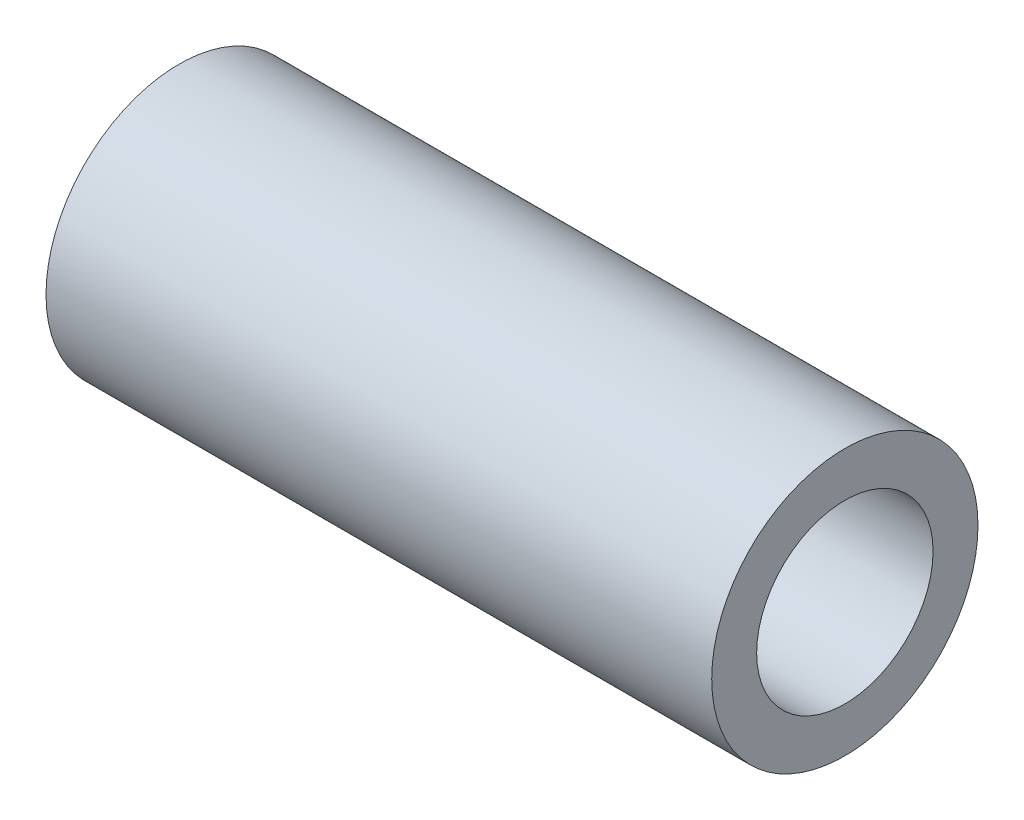
ISO-10303-21;
HEADER;
FILE_DESCRIPTION(('STEP AP214'),'2;1');
FILE_NAME('part.step','',(''),(''),'','','');
FILE_SCHEMA(('AUTOMOTIVE_DESIGN { 1 0 10303 214 1 1 1 1 }'));
ENDSEC;
DATA;
#1=APPLICATION_CONTEXT('core data for automotive mechanical design processes');
#2=APPLICATION_PROTOCOL_DEFINITION('international standard','automotive_design',2000,#1);
#3=PRODUCT_CONTEXT('',#1,'mechanical');
#4=PRODUCT('Part','Part','',(#3));
#5=PRODUCT_RELATED_PRODUCT_CATEGORY('part','',(#4));
#6=PRODUCT_DEFINITION_FORMATION('','',#4);
#7=PRODUCT_DEFINITION_CONTEXT('part definition',#1,'design');
#8=PRODUCT_DEFINITION('design','',#6,#7);
#9=PRODUCT_DEFINITION_SHAPE('','',#8);
#10=(LENGTH_UNIT() NAMED_UNIT(*) SI_UNIT(.MILLI.,.METRE.));
#11=(NAMED_UNIT(*) PLANE_ANGLE_UNIT() SI_UNIT($,.RADIAN.));
#12=(NAMED_UNIT(*) SI_UNIT($,.STERADIAN.) SOLID_ANGLE_UNIT());
#13=UNCERTAINTY_MEASURE_WITH_UNIT(LENGTH_MEASURE(1.E-05),#10,'distance_accuracy_value','');
#14=(GEOMETRIC_REPRESENTATION_CONTEXT(3) GLOBAL_UNCERTAINTY_ASSIGNED_CONTEXT((#13)) GLOBAL_UNIT_ASSIGNED_CONTEXT((#10,
#11,#12)) REPRESENTATION_CONTEXT('',''));
#15=CARTESIAN_POINT('',(0.,0.,0.));
#16=DIRECTION('',(0.,0.,1.));
#17=DIRECTION('',(1.,0.,0.));
#18=AXIS2_PLACEMENT_3D('',#15,#16,#17);
#19=CARTESIAN_POINT('',(20.,0.,0.));
#20=DIRECTION('',(1.,0.,0.));
#21=DIRECTION('',(0.,0.,-1.));
#22=AXIS2_PLACEMENT_3D('',#19,#20,#21);
#23=PLANE('',#22);
#24=CARTESIAN_POINT('',(20.,0.,0.));
#25=DIRECTION('',(1.,0.,0.));
#26=DIRECTION('',(0.,0.,-1.));
#27=AXIS2_PLACEMENT_3D('',#24,#25,#26);
#28=CIRCLE('',#27,4.);
#29=CARTESIAN_POINT('',(20.,0.,-4.));
#30=VERTEX_POINT('',#29);
#31=EDGE_CURVE('E10',#30,#30,#28,.T.);
#32=ORIENTED_EDGE('',*,*,#31,.T.);
#33=EDGE_LOOP('',(#32));
#34=FACE_BOUND('',#33,.T.);
#35=CARTESIAN_POINT('',(20.,0.,0.));
#36=DIRECTION('',(1.,0.,0.));
#37=DIRECTION('',(0.,0.,-1.));
#38=AXIS2_PLACEMENT_3D('',#35,#36,#37);
#39=CIRCLE('',#38,2.65);
#40=CARTESIAN_POINT('',(20.,0.,-2.65));
#41=VERTEX_POINT('',#40);
#42=EDGE_CURVE('E42',#41,#41,#39,.T.);
#43=ORIENTED_EDGE('',*,*,#42,.F.);
#44=EDGE_LOOP('',(#43));
#45=FACE_BOUND('',#44,.T.);
#46=ADVANCED_FACE('F31',(#34,#45),#23,.T.);
#47=CARTESIAN_POINT('',(0.,0.,0.));
#48=DIRECTION('',(1.,0.,0.));
#49=DIRECTION('',(0.,0.,-1.));
#50=AXIS2_PLACEMENT_3D('',#47,#48,#49);
#51=PLANE('',#50);
#52=CARTESIAN_POINT('',(0.,0.,0.));
#53=DIRECTION('',(1.,0.,0.));
#54=DIRECTION('',(0.,0.,-1.));
#55=AXIS2_PLACEMENT_3D('',#52,#53,#54);
#56=CIRCLE('',#55,4.);
#57=CARTESIAN_POINT('',(0.,0.,-4.));
#58=VERTEX_POINT('',#57);
#59=EDGE_CURVE('E35',#58,#58,#56,.T.);
#60=ORIENTED_EDGE('',*,*,#59,.F.);
#61=EDGE_LOOP('',(#60));
#62=FACE_BOUND('',#61,.T.);
#63=CARTESIAN_POINT('',(0.,0.,0.));
#64=DIRECTION('',(1.,0.,0.));
#65=DIRECTION('',(0.,0.,-1.));
#66=AXIS2_PLACEMENT_3D('',#63,#64,#65);
#67=CIRCLE('',#66,2.65);
#68=CARTESIAN_POINT('',(0.,0.,-2.65));
#69=VERTEX_POINT('',#68);
#70=EDGE_CURVE('E44',#69,#69,#67,.T.);
#71=ORIENTED_EDGE('',*,*,#70,.T.);
#72=EDGE_LOOP('',(#71));
#73=FACE_BOUND('',#72,.T.);
#74=ADVANCED_FACE('F54',(#62,#73),#51,.F.);
#75=CARTESIAN_POINT('',(20.,0.,0.));
#76=DIRECTION('',(-1.,0.,0.));
#77=DIRECTION('',(0.,0.,1.));
#78=AXIS2_PLACEMENT_3D('',#75,#76,#77);
#79=CYLINDRICAL_SURFACE('',#78,4.);
#80=ORIENTED_EDGE('',*,*,#31,.F.);
#81=EDGE_LOOP('',(#80));
#82=FACE_BOUND('',#81,.T.);
#83=ORIENTED_EDGE('',*,*,#59,.T.);
#84=EDGE_LOOP('',(#83));
#85=FACE_BOUND('',#84,.T.);
#86=ADVANCED_FACE('F33',(#82,#85),#79,.T.);
#87=CARTESIAN_POINT('',(20.,0.,0.));
#88=DIRECTION('',(-1.,0.,0.));
#89=DIRECTION('',(0.,0.,1.));
#90=AXIS2_PLACEMENT_3D('',#87,#88,#89);
#91=CYLINDRICAL_SURFACE('',#90,2.65);
#92=ORIENTED_EDGE('',*,*,#42,.T.);
#93=EDGE_LOOP('',(#92));
#94=FACE_BOUND('',#93,.T.);
#95=ORIENTED_EDGE('',*,*,#70,.F.);
#96=EDGE_LOOP('',(#95));
#97=FACE_BOUND('',#96,.T.);
#98=ADVANCED_FACE('F50',(#94,#97),#91,.F.);
#99=CLOSED_SHELL('',(#46,#74,#86,#98));
#100=MANIFOLD_SOLID_BREP('B2',#99);
#101=ADVANCED_BREP_SHAPE_REPRESENTATION('',(#18,#100),#14);
#102=SHAPE_DEFINITION_REPRESENTATION(#9,#101);
ENDSEC;
END-ISO-10303-21;
